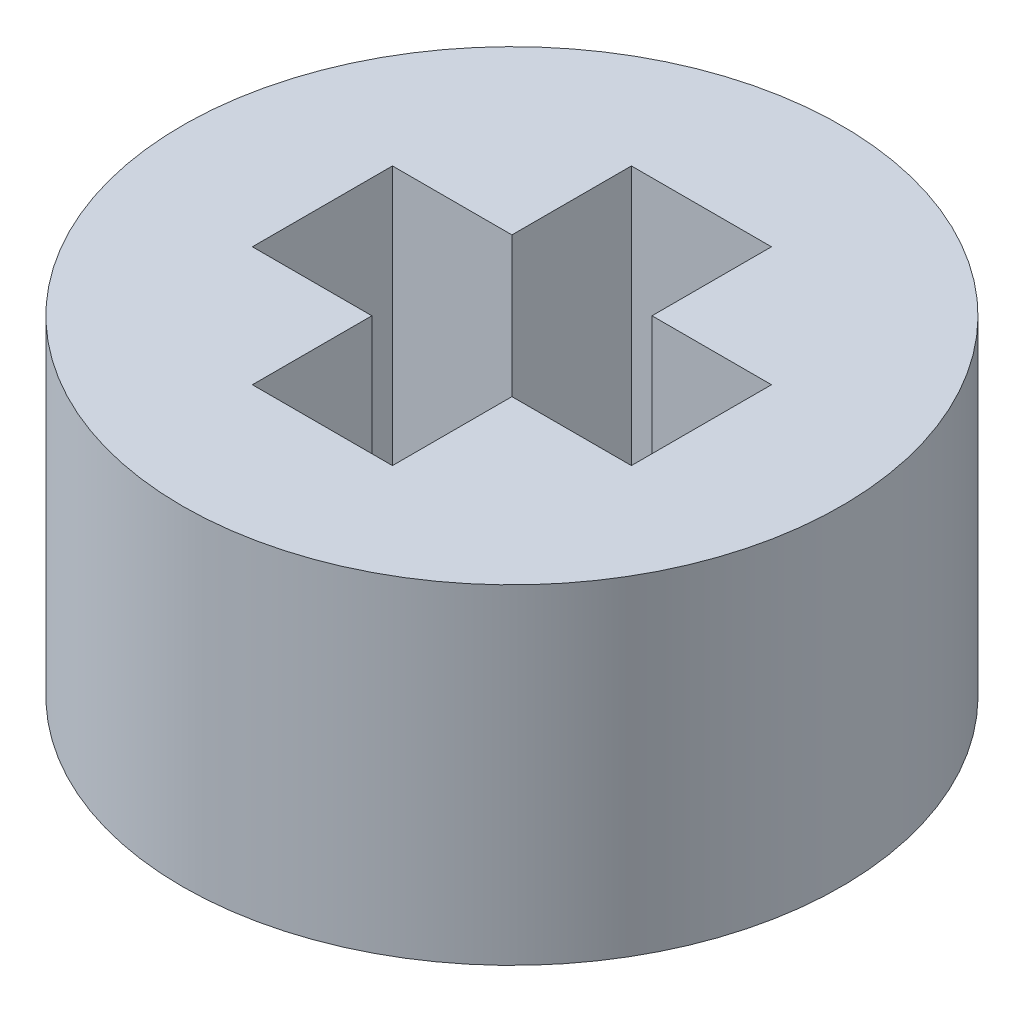
ISO-10303-21;
HEADER;
FILE_DESCRIPTION(('STEP AP214'),'2;1');
FILE_NAME('part.step','',(''),(''),'','','');
FILE_SCHEMA(('AUTOMOTIVE_DESIGN { 1 0 10303 214 1 1 1 1 }'));
ENDSEC;
DATA;
#1=APPLICATION_CONTEXT('core data for automotive mechanical design processes');
#2=APPLICATION_PROTOCOL_DEFINITION('international standard','automotive_design',2000,#1);
#3=PRODUCT_CONTEXT('',#1,'mechanical');
#4=PRODUCT('Part','Part','',(#3));
#5=PRODUCT_RELATED_PRODUCT_CATEGORY('part','',(#4));
#6=PRODUCT_DEFINITION_FORMATION('','',#4);
#7=PRODUCT_DEFINITION_CONTEXT('part definition',#1,'design');
#8=PRODUCT_DEFINITION('design','',#6,#7);
#9=PRODUCT_DEFINITION_SHAPE('','',#8);
#10=(LENGTH_UNIT() NAMED_UNIT(*) SI_UNIT(.MILLI.,.METRE.));
#11=(NAMED_UNIT(*) PLANE_ANGLE_UNIT() SI_UNIT($,.RADIAN.));
#12=(NAMED_UNIT(*) SI_UNIT($,.STERADIAN.) SOLID_ANGLE_UNIT());
#13=UNCERTAINTY_MEASURE_WITH_UNIT(LENGTH_MEASURE(1.E-05),#10,'distance_accuracy_value','');
#14=(GEOMETRIC_REPRESENTATION_CONTEXT(3) GLOBAL_UNCERTAINTY_ASSIGNED_CONTEXT((#13)) GLOBAL_UNIT_ASSIGNED_CONTEXT((#10,
#11,#12)) REPRESENTATION_CONTEXT('',''));
#15=CARTESIAN_POINT('',(0.,0.,0.));
#16=DIRECTION('',(0.,0.,1.));
#17=DIRECTION('',(1.,0.,0.));
#18=AXIS2_PLACEMENT_3D('',#15,#16,#17);
#19=CARTESIAN_POINT('',(0.,4.,0.));
#20=DIRECTION('',(0.,1.,0.));
#21=DIRECTION('',(0.,0.,1.));
#22=AXIS2_PLACEMENT_3D('',#19,#20,#21);
#23=PLANE('',#22);
#24=CARTESIAN_POINT('',(0.,4.,0.));
#25=DIRECTION('',(0.,1.,0.));
#26=DIRECTION('',(0.,0.,1.));
#27=AXIS2_PLACEMENT_3D('',#24,#25,#26);
#28=CIRCLE('',#27,4.);
#29=CARTESIAN_POINT('',(0.,4.,4.));
#30=VERTEX_POINT('',#29);
#31=EDGE_CURVE('E11',#30,#30,#28,.T.);
#32=ORIENTED_EDGE('',*,*,#31,.T.);
#33=EDGE_LOOP('',(#32));
#34=FACE_BOUND('',#33,.T.);
#35=DIRECTION('',(1.,0.,0.));
#36=VECTOR('',#35,1.);
#37=CARTESIAN_POINT('',(0.85,4.,0.85));
#38=LINE('',#37,#36);
#39=CARTESIAN_POINT('',(0.85,4.,0.85));
#40=VERTEX_POINT('',#39);
#41=CARTESIAN_POINT('',(2.3,4.,0.85));
#42=VERTEX_POINT('',#41);
#43=EDGE_CURVE('E136',#40,#42,#38,.T.);
#44=ORIENTED_EDGE('',*,*,#43,.F.);
#45=DIRECTION('',(0.,0.,-1.));
#46=VECTOR('',#45,1.);
#47=CARTESIAN_POINT('',(0.85,4.,0.85));
#48=LINE('',#47,#46);
#49=CARTESIAN_POINT('',(0.850000000000001,4.,2.3));
#50=VERTEX_POINT('',#49);
#51=EDGE_CURVE('E128',#50,#40,#48,.T.);
#52=ORIENTED_EDGE('',*,*,#51,.F.);
#53=DIRECTION('',(1.,0.,0.));
#54=VECTOR('',#53,1.);
#55=CARTESIAN_POINT('',(-0.849999999999999,4.,2.3));
#56=LINE('',#55,#54);
#57=CARTESIAN_POINT('',(-0.849999999999999,4.,2.3));
#58=VERTEX_POINT('',#57);
#59=EDGE_CURVE('E168',#58,#50,#56,.T.);
#60=ORIENTED_EDGE('',*,*,#59,.F.);
#61=DIRECTION('',(0.,0.,1.));
#62=VECTOR('',#61,1.);
#63=CARTESIAN_POINT('',(-0.85,4.,0.85));
#64=LINE('',#63,#62);
#65=CARTESIAN_POINT('',(-0.85,4.,0.85));
#66=VERTEX_POINT('',#65);
#67=EDGE_CURVE('E166',#66,#58,#64,.T.);
#68=ORIENTED_EDGE('',*,*,#67,.F.);
#69=DIRECTION('',(1.,0.,0.));
#70=VECTOR('',#69,1.);
#71=CARTESIAN_POINT('',(-2.3,4.,0.85));
#72=LINE('',#71,#70);
#73=CARTESIAN_POINT('',(-2.3,4.,0.85));
#74=VERTEX_POINT('',#73);
#75=EDGE_CURVE('E164',#74,#66,#72,.T.);
#76=ORIENTED_EDGE('',*,*,#75,.F.);
#77=DIRECTION('',(0.,0.,1.));
#78=VECTOR('',#77,1.);
#79=CARTESIAN_POINT('',(-2.3,4.,-0.85));
#80=LINE('',#79,#78);
#81=CARTESIAN_POINT('',(-2.3,4.,-0.85));
#82=VERTEX_POINT('',#81);
#83=EDGE_CURVE('E162',#82,#74,#80,.T.);
#84=ORIENTED_EDGE('',*,*,#83,.F.);
#85=DIRECTION('',(-1.,0.,0.));
#86=VECTOR('',#85,1.);
#87=CARTESIAN_POINT('',(-2.3,4.,-0.85));
#88=LINE('',#87,#86);
#89=CARTESIAN_POINT('',(-0.85,4.,-0.85));
#90=VERTEX_POINT('',#89);
#91=EDGE_CURVE('E160',#90,#82,#88,.T.);
#92=ORIENTED_EDGE('',*,*,#91,.F.);
#93=DIRECTION('',(0.,0.,1.));
#94=VECTOR('',#93,1.);
#95=CARTESIAN_POINT('',(-0.85,4.,-2.3));
#96=LINE('',#95,#94);
#97=CARTESIAN_POINT('',(-0.85,4.,-2.3));
#98=VERTEX_POINT('',#97);
#99=EDGE_CURVE('E158',#98,#90,#96,.T.);
#100=ORIENTED_EDGE('',*,*,#99,.F.);
#101=DIRECTION('',(-1.,0.,0.));
#102=VECTOR('',#101,1.);
#103=CARTESIAN_POINT('',(-0.85,4.,-2.3));
#104=LINE('',#103,#102);
#105=CARTESIAN_POINT('',(0.85,4.,-2.3));
#106=VERTEX_POINT('',#105);
#107=EDGE_CURVE('E156',#106,#98,#104,.T.);
#108=ORIENTED_EDGE('',*,*,#107,.F.);
#109=DIRECTION('',(0.,0.,-1.));
#110=VECTOR('',#109,1.);
#111=CARTESIAN_POINT('',(0.85,4.,-2.3));
#112=LINE('',#111,#110);
#113=CARTESIAN_POINT('',(0.85,4.,-0.85));
#114=VERTEX_POINT('',#113);
#115=EDGE_CURVE('E154',#114,#106,#112,.T.);
#116=ORIENTED_EDGE('',*,*,#115,.F.);
#117=DIRECTION('',(-1.,0.,0.));
#118=VECTOR('',#117,1.);
#119=CARTESIAN_POINT('',(0.85,4.,-0.85));
#120=LINE('',#119,#118);
#121=CARTESIAN_POINT('',(2.3,4.,-0.85));
#122=VERTEX_POINT('',#121);
#123=EDGE_CURVE('E150',#122,#114,#120,.T.);
#124=ORIENTED_EDGE('',*,*,#123,.F.);
#125=DIRECTION('',(0.,0.,-1.));
#126=VECTOR('',#125,1.);
#127=CARTESIAN_POINT('',(2.3,4.,-0.85));
#128=LINE('',#127,#126);
#129=EDGE_CURVE('E148',#42,#122,#128,.T.);
#130=ORIENTED_EDGE('',*,*,#129,.F.);
#131=EDGE_LOOP('',(#44,#52,#60,#68,#76,#84,#92,#100,#108,#116,#124,#130));
#132=FACE_BOUND('',#131,.T.);
#133=ADVANCED_FACE('F39',(#34,#132),#23,.T.);
#134=CARTESIAN_POINT('',(0.,0.,0.));
#135=DIRECTION('',(0.,1.,0.));
#136=DIRECTION('',(0.,0.,1.));
#137=AXIS2_PLACEMENT_3D('',#134,#135,#136);
#138=PLANE('',#137);
#139=CARTESIAN_POINT('',(0.,0.,0.));
#140=DIRECTION('',(0.,1.,0.));
#141=DIRECTION('',(0.,0.,1.));
#142=AXIS2_PLACEMENT_3D('',#139,#140,#141);
#143=CIRCLE('',#142,4.);
#144=CARTESIAN_POINT('',(0.,0.,4.));
#145=VERTEX_POINT('',#144);
#146=EDGE_CURVE('E43',#145,#145,#143,.T.);
#147=ORIENTED_EDGE('',*,*,#146,.F.);
#148=EDGE_LOOP('',(#147));
#149=FACE_BOUND('',#148,.T.);
#150=DIRECTION('',(0.,0.,-1.));
#151=VECTOR('',#150,1.);
#152=CARTESIAN_POINT('',(0.85,0.,0.85));
#153=LINE('',#152,#151);
#154=CARTESIAN_POINT('',(0.850000000000001,0.,2.3));
#155=VERTEX_POINT('',#154);
#156=CARTESIAN_POINT('',(0.85,0.,0.85));
#157=VERTEX_POINT('',#156);
#158=EDGE_CURVE('E62',#155,#157,#153,.T.);
#159=ORIENTED_EDGE('',*,*,#158,.T.);
#160=DIRECTION('',(1.,0.,0.));
#161=VECTOR('',#160,1.);
#162=CARTESIAN_POINT('',(0.85,0.,0.85));
#163=LINE('',#162,#161);
#164=CARTESIAN_POINT('',(2.3,0.,0.85));
#165=VERTEX_POINT('',#164);
#166=EDGE_CURVE('E143',#157,#165,#163,.T.);
#167=ORIENTED_EDGE('',*,*,#166,.T.);
#168=DIRECTION('',(0.,0.,-1.));
#169=VECTOR('',#168,1.);
#170=CARTESIAN_POINT('',(2.3,0.,-0.85));
#171=LINE('',#170,#169);
#172=CARTESIAN_POINT('',(2.3,0.,-0.85));
#173=VERTEX_POINT('',#172);
#174=EDGE_CURVE('E172',#165,#173,#171,.T.);
#175=ORIENTED_EDGE('',*,*,#174,.T.);
#176=DIRECTION('',(-1.,0.,0.));
#177=VECTOR('',#176,1.);
#178=CARTESIAN_POINT('',(0.85,0.,-0.85));
#179=LINE('',#178,#177);
#180=CARTESIAN_POINT('',(0.85,0.,-0.85));
#181=VERTEX_POINT('',#180);
#182=EDGE_CURVE('E175',#173,#181,#179,.T.);
#183=ORIENTED_EDGE('',*,*,#182,.T.);
#184=DIRECTION('',(0.,0.,-1.));
#185=VECTOR('',#184,1.);
#186=CARTESIAN_POINT('',(0.85,0.,-2.3));
#187=LINE('',#186,#185);
#188=CARTESIAN_POINT('',(0.85,0.,-2.3));
#189=VERTEX_POINT('',#188);
#190=EDGE_CURVE('E178',#181,#189,#187,.T.);
#191=ORIENTED_EDGE('',*,*,#190,.T.);
#192=DIRECTION('',(-1.,0.,0.));
#193=VECTOR('',#192,1.);
#194=CARTESIAN_POINT('',(-0.85,0.,-2.3));
#195=LINE('',#194,#193);
#196=CARTESIAN_POINT('',(-0.85,0.,-2.3));
#197=VERTEX_POINT('',#196);
#198=EDGE_CURVE('E181',#189,#197,#195,.T.);
#199=ORIENTED_EDGE('',*,*,#198,.T.);
#200=DIRECTION('',(0.,0.,1.));
#201=VECTOR('',#200,1.);
#202=CARTESIAN_POINT('',(-0.85,0.,-2.3));
#203=LINE('',#202,#201);
#204=CARTESIAN_POINT('',(-0.85,0.,-0.85));
#205=VERTEX_POINT('',#204);
#206=EDGE_CURVE('E184',#197,#205,#203,.T.);
#207=ORIENTED_EDGE('',*,*,#206,.T.);
#208=DIRECTION('',(-1.,0.,0.));
#209=VECTOR('',#208,1.);
#210=CARTESIAN_POINT('',(-2.3,0.,-0.85));
#211=LINE('',#210,#209);
#212=CARTESIAN_POINT('',(-2.3,0.,-0.85));
#213=VERTEX_POINT('',#212);
#214=EDGE_CURVE('E187',#205,#213,#211,.T.);
#215=ORIENTED_EDGE('',*,*,#214,.T.);
#216=DIRECTION('',(0.,0.,1.));
#217=VECTOR('',#216,1.);
#218=CARTESIAN_POINT('',(-2.3,0.,-0.85));
#219=LINE('',#218,#217);
#220=CARTESIAN_POINT('',(-2.3,0.,0.85));
#221=VERTEX_POINT('',#220);
#222=EDGE_CURVE('E190',#213,#221,#219,.T.);
#223=ORIENTED_EDGE('',*,*,#222,.T.);
#224=DIRECTION('',(1.,0.,0.));
#225=VECTOR('',#224,1.);
#226=CARTESIAN_POINT('',(-2.3,0.,0.85));
#227=LINE('',#226,#225);
#228=CARTESIAN_POINT('',(-0.85,0.,0.85));
#229=VERTEX_POINT('',#228);
#230=EDGE_CURVE('E193',#221,#229,#227,.T.);
#231=ORIENTED_EDGE('',*,*,#230,.T.);
#232=DIRECTION('',(0.,0.,1.));
#233=VECTOR('',#232,1.);
#234=CARTESIAN_POINT('',(-0.85,0.,0.85));
#235=LINE('',#234,#233);
#236=CARTESIAN_POINT('',(-0.849999999999999,0.,2.3));
#237=VERTEX_POINT('',#236);
#238=EDGE_CURVE('E196',#229,#237,#235,.T.);
#239=ORIENTED_EDGE('',*,*,#238,.T.);
#240=DIRECTION('',(1.,0.,0.));
#241=VECTOR('',#240,1.);
#242=CARTESIAN_POINT('',(-0.849999999999999,0.,2.3));
#243=LINE('',#242,#241);
#244=EDGE_CURVE('E137',#237,#155,#243,.T.);
#245=ORIENTED_EDGE('',*,*,#244,.T.);
#246=EDGE_LOOP('',(#159,#167,#175,#183,#191,#199,#207,#215,#223,#231,#239,#245));
#247=FACE_BOUND('',#246,.T.);
#248=ADVANCED_FACE('F225',(#149,#247),#138,.F.);
#249=CARTESIAN_POINT('',(0.,4.,0.));
#250=DIRECTION('',(0.,-1.,0.));
#251=DIRECTION('',(0.,0.,-1.));
#252=AXIS2_PLACEMENT_3D('',#249,#250,#251);
#253=CYLINDRICAL_SURFACE('',#252,4.);
#254=ORIENTED_EDGE('',*,*,#31,.F.);
#255=EDGE_LOOP('',(#254));
#256=FACE_BOUND('',#255,.T.);
#257=ORIENTED_EDGE('',*,*,#146,.T.);
#258=EDGE_LOOP('',(#257));
#259=FACE_BOUND('',#258,.T.);
#260=ADVANCED_FACE('F41',(#256,#259),#253,.T.);
#261=CARTESIAN_POINT('',(0.85,4.,0.85));
#262=DIRECTION('',(-1.,0.,0.));
#263=DIRECTION('',(0.,0.,1.));
#264=AXIS2_PLACEMENT_3D('',#261,#262,#263);
#265=PLANE('',#264);
#266=ORIENTED_EDGE('',*,*,#158,.F.);
#267=DIRECTION('',(0.,-1.,0.));
#268=VECTOR('',#267,1.);
#269=CARTESIAN_POINT('',(0.850000000000001,4.,2.3));
#270=LINE('',#269,#268);
#271=EDGE_CURVE('E132',#50,#155,#270,.T.);
#272=ORIENTED_EDGE('',*,*,#271,.F.);
#273=ORIENTED_EDGE('',*,*,#51,.T.);
#274=DIRECTION('',(0.,-1.,0.));
#275=VECTOR('',#274,1.);
#276=CARTESIAN_POINT('',(0.85,4.,0.85));
#277=LINE('',#276,#275);
#278=EDGE_CURVE('E131',#40,#157,#277,.T.);
#279=ORIENTED_EDGE('',*,*,#278,.T.);
#280=EDGE_LOOP('',(#266,#272,#273,#279));
#281=FACE_BOUND('',#280,.T.);
#282=ADVANCED_FACE('F130',(#281),#265,.T.);
#283=CARTESIAN_POINT('',(0.85,4.,0.85));
#284=DIRECTION('',(0.,0.,-1.));
#285=DIRECTION('',(-1.,0.,0.));
#286=AXIS2_PLACEMENT_3D('',#283,#284,#285);
#287=PLANE('',#286);
#288=ORIENTED_EDGE('',*,*,#166,.F.);
#289=ORIENTED_EDGE('',*,*,#278,.F.);
#290=ORIENTED_EDGE('',*,*,#43,.T.);
#291=DIRECTION('',(0.,-1.,0.));
#292=VECTOR('',#291,1.);
#293=CARTESIAN_POINT('',(2.3,4.,0.85));
#294=LINE('',#293,#292);
#295=EDGE_CURVE('E144',#42,#165,#294,.T.);
#296=ORIENTED_EDGE('',*,*,#295,.T.);
#297=EDGE_LOOP('',(#288,#289,#290,#296));
#298=FACE_BOUND('',#297,.T.);
#299=ADVANCED_FACE('F140',(#298),#287,.T.);
#300=CARTESIAN_POINT('',(2.3,4.,-0.85));
#301=DIRECTION('',(-1.,0.,0.));
#302=DIRECTION('',(0.,0.,1.));
#303=AXIS2_PLACEMENT_3D('',#300,#301,#302);
#304=PLANE('',#303);
#305=ORIENTED_EDGE('',*,*,#174,.F.);
#306=ORIENTED_EDGE('',*,*,#295,.F.);
#307=ORIENTED_EDGE('',*,*,#129,.T.);
#308=DIRECTION('',(0.,-1.,0.));
#309=VECTOR('',#308,1.);
#310=CARTESIAN_POINT('',(2.3,4.,-0.85));
#311=LINE('',#310,#309);
#312=EDGE_CURVE('E217',#122,#173,#311,.T.);
#313=ORIENTED_EDGE('',*,*,#312,.T.);
#314=EDGE_LOOP('',(#305,#306,#307,#313));
#315=FACE_BOUND('',#314,.T.);
#316=ADVANCED_FACE('F221',(#315),#304,.T.);
#317=CARTESIAN_POINT('',(0.85,4.,-0.85));
#318=DIRECTION('',(0.,0.,1.));
#319=DIRECTION('',(1.,0.,0.));
#320=AXIS2_PLACEMENT_3D('',#317,#318,#319);
#321=PLANE('',#320);
#322=ORIENTED_EDGE('',*,*,#182,.F.);
#323=ORIENTED_EDGE('',*,*,#312,.F.);
#324=ORIENTED_EDGE('',*,*,#123,.T.);
#325=DIRECTION('',(0.,-1.,0.));
#326=VECTOR('',#325,1.);
#327=CARTESIAN_POINT('',(0.85,4.,-0.85));
#328=LINE('',#327,#326);
#329=EDGE_CURVE('E215',#114,#181,#328,.T.);
#330=ORIENTED_EDGE('',*,*,#329,.T.);
#331=EDGE_LOOP('',(#322,#323,#324,#330));
#332=FACE_BOUND('',#331,.T.);
#333=ADVANCED_FACE('F263',(#332),#321,.T.);
#334=CARTESIAN_POINT('',(0.85,4.,-2.3));
#335=DIRECTION('',(-1.,0.,0.));
#336=DIRECTION('',(0.,0.,1.));
#337=AXIS2_PLACEMENT_3D('',#334,#335,#336);
#338=PLANE('',#337);
#339=ORIENTED_EDGE('',*,*,#190,.F.);
#340=ORIENTED_EDGE('',*,*,#329,.F.);
#341=ORIENTED_EDGE('',*,*,#115,.T.);
#342=DIRECTION('',(0.,-1.,0.));
#343=VECTOR('',#342,1.);
#344=CARTESIAN_POINT('',(0.85,4.,-2.3));
#345=LINE('',#344,#343);
#346=EDGE_CURVE('E213',#106,#189,#345,.T.);
#347=ORIENTED_EDGE('',*,*,#346,.T.);
#348=EDGE_LOOP('',(#339,#340,#341,#347));
#349=FACE_BOUND('',#348,.T.);
#350=ADVANCED_FACE('F261',(#349),#338,.T.);
#351=CARTESIAN_POINT('',(-0.85,4.,-2.3));
#352=DIRECTION('',(0.,0.,1.));
#353=DIRECTION('',(1.,0.,0.));
#354=AXIS2_PLACEMENT_3D('',#351,#352,#353);
#355=PLANE('',#354);
#356=ORIENTED_EDGE('',*,*,#198,.F.);
#357=ORIENTED_EDGE('',*,*,#346,.F.);
#358=ORIENTED_EDGE('',*,*,#107,.T.);
#359=DIRECTION('',(0.,-1.,0.));
#360=VECTOR('',#359,1.);
#361=CARTESIAN_POINT('',(-0.85,4.,-2.3));
#362=LINE('',#361,#360);
#363=EDGE_CURVE('E211',#98,#197,#362,.T.);
#364=ORIENTED_EDGE('',*,*,#363,.T.);
#365=EDGE_LOOP('',(#356,#357,#358,#364));
#366=FACE_BOUND('',#365,.T.);
#367=ADVANCED_FACE('F255',(#366),#355,.T.);
#368=CARTESIAN_POINT('',(-0.85,4.,-2.3));
#369=DIRECTION('',(1.,0.,0.));
#370=DIRECTION('',(0.,0.,-1.));
#371=AXIS2_PLACEMENT_3D('',#368,#369,#370);
#372=PLANE('',#371);
#373=ORIENTED_EDGE('',*,*,#206,.F.);
#374=ORIENTED_EDGE('',*,*,#363,.F.);
#375=ORIENTED_EDGE('',*,*,#99,.T.);
#376=DIRECTION('',(0.,-1.,0.));
#377=VECTOR('',#376,1.);
#378=CARTESIAN_POINT('',(-0.85,4.,-0.85));
#379=LINE('',#378,#377);
#380=EDGE_CURVE('E209',#90,#205,#379,.T.);
#381=ORIENTED_EDGE('',*,*,#380,.T.);
#382=EDGE_LOOP('',(#373,#374,#375,#381));
#383=FACE_BOUND('',#382,.T.);
#384=ADVANCED_FACE('F251',(#383),#372,.T.);
#385=CARTESIAN_POINT('',(-2.3,4.,-0.85));
#386=DIRECTION('',(0.,0.,1.));
#387=DIRECTION('',(1.,0.,0.));
#388=AXIS2_PLACEMENT_3D('',#385,#386,#387);
#389=PLANE('',#388);
#390=ORIENTED_EDGE('',*,*,#214,.F.);
#391=ORIENTED_EDGE('',*,*,#380,.F.);
#392=ORIENTED_EDGE('',*,*,#91,.T.);
#393=DIRECTION('',(0.,-1.,0.));
#394=VECTOR('',#393,1.);
#395=CARTESIAN_POINT('',(-2.3,4.,-0.85));
#396=LINE('',#395,#394);
#397=EDGE_CURVE('E207',#82,#213,#396,.T.);
#398=ORIENTED_EDGE('',*,*,#397,.T.);
#399=EDGE_LOOP('',(#390,#391,#392,#398));
#400=FACE_BOUND('',#399,.T.);
#401=ADVANCED_FACE('F248',(#400),#389,.T.);
#402=CARTESIAN_POINT('',(-2.3,4.,-0.85));
#403=DIRECTION('',(1.,0.,0.));
#404=DIRECTION('',(0.,0.,-1.));
#405=AXIS2_PLACEMENT_3D('',#402,#403,#404);
#406=PLANE('',#405);
#407=ORIENTED_EDGE('',*,*,#222,.F.);
#408=ORIENTED_EDGE('',*,*,#397,.F.);
#409=ORIENTED_EDGE('',*,*,#83,.T.);
#410=DIRECTION('',(0.,-1.,0.));
#411=VECTOR('',#410,1.);
#412=CARTESIAN_POINT('',(-2.3,4.,0.85));
#413=LINE('',#412,#411);
#414=EDGE_CURVE('E205',#74,#221,#413,.T.);
#415=ORIENTED_EDGE('',*,*,#414,.T.);
#416=EDGE_LOOP('',(#407,#408,#409,#415));
#417=FACE_BOUND('',#416,.T.);
#418=ADVANCED_FACE('F240',(#417),#406,.T.);
#419=CARTESIAN_POINT('',(-2.3,4.,0.85));
#420=DIRECTION('',(0.,0.,-1.));
#421=DIRECTION('',(-1.,0.,0.));
#422=AXIS2_PLACEMENT_3D('',#419,#420,#421);
#423=PLANE('',#422);
#424=ORIENTED_EDGE('',*,*,#230,.F.);
#425=ORIENTED_EDGE('',*,*,#414,.F.);
#426=ORIENTED_EDGE('',*,*,#75,.T.);
#427=DIRECTION('',(0.,-1.,0.));
#428=VECTOR('',#427,1.);
#429=CARTESIAN_POINT('',(-0.85,4.,0.85));
#430=LINE('',#429,#428);
#431=EDGE_CURVE('E203',#66,#229,#430,.T.);
#432=ORIENTED_EDGE('',*,*,#431,.T.);
#433=EDGE_LOOP('',(#424,#425,#426,#432));
#434=FACE_BOUND('',#433,.T.);
#435=ADVANCED_FACE('F236',(#434),#423,.T.);
#436=CARTESIAN_POINT('',(-0.85,4.,0.85));
#437=DIRECTION('',(1.,0.,0.));
#438=DIRECTION('',(0.,0.,-1.));
#439=AXIS2_PLACEMENT_3D('',#436,#437,#438);
#440=PLANE('',#439);
#441=ORIENTED_EDGE('',*,*,#238,.F.);
#442=ORIENTED_EDGE('',*,*,#431,.F.);
#443=ORIENTED_EDGE('',*,*,#67,.T.);
#444=DIRECTION('',(0.,-1.,0.));
#445=VECTOR('',#444,1.);
#446=CARTESIAN_POINT('',(-0.849999999999999,4.,2.3));
#447=LINE('',#446,#445);
#448=EDGE_CURVE('E54',#58,#237,#447,.T.);
#449=ORIENTED_EDGE('',*,*,#448,.T.);
#450=EDGE_LOOP('',(#441,#442,#443,#449));
#451=FACE_BOUND('',#450,.T.);
#452=ADVANCED_FACE('F233',(#451),#440,.T.);
#453=CARTESIAN_POINT('',(-0.849999999999999,4.,2.3));
#454=DIRECTION('',(0.,0.,-1.));
#455=DIRECTION('',(-1.,0.,0.));
#456=AXIS2_PLACEMENT_3D('',#453,#454,#455);
#457=PLANE('',#456);
#458=ORIENTED_EDGE('',*,*,#244,.F.);
#459=ORIENTED_EDGE('',*,*,#448,.F.);
#460=ORIENTED_EDGE('',*,*,#59,.T.);
#461=ORIENTED_EDGE('',*,*,#271,.T.);
#462=EDGE_LOOP('',(#458,#459,#460,#461));
#463=FACE_BOUND('',#462,.T.);
#464=ADVANCED_FACE('F227',(#463),#457,.T.);
#465=CLOSED_SHELL('',(#133,#248,#260,#282,#299,#316,#333,#350,#367,#384,#401,#418,#435,#452,#464));
#466=MANIFOLD_SOLID_BREP('B2',#465);
#467=ADVANCED_BREP_SHAPE_REPRESENTATION('',(#18,#466),#14);
#468=SHAPE_DEFINITION_REPRESENTATION(#9,#467);
ENDSEC;
END-ISO-10303-21;
